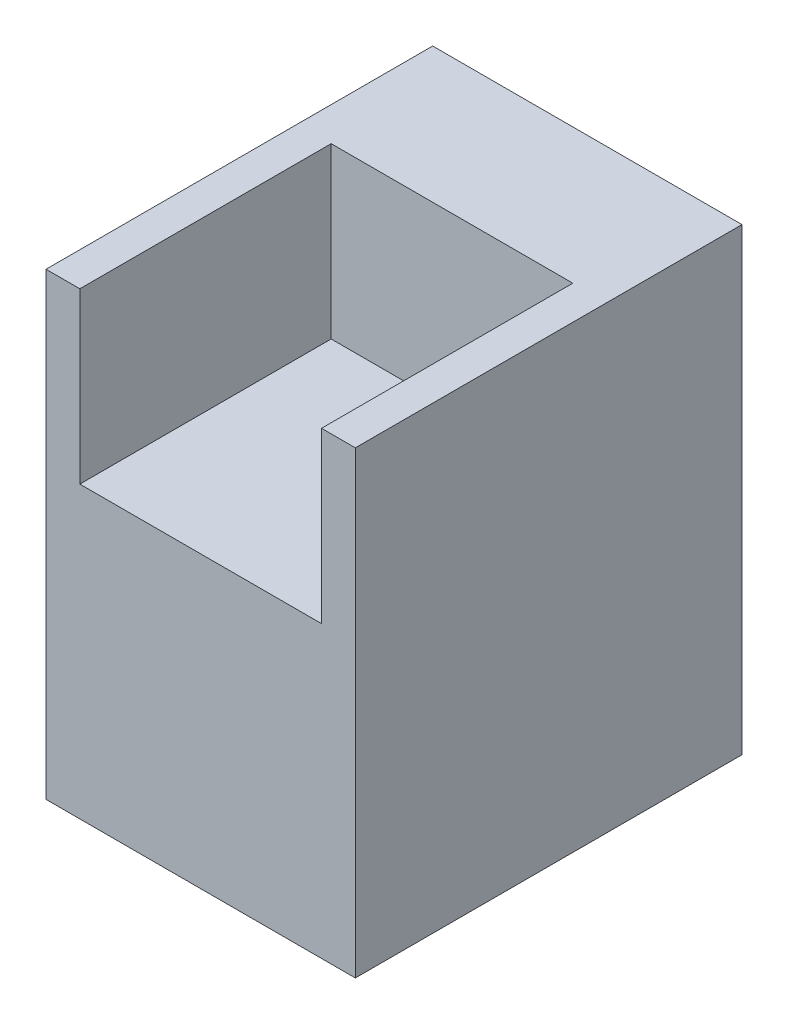
ISO-10303-21;
HEADER;
FILE_DESCRIPTION(('STEP AP214'),'2;1');
FILE_NAME('part.step','',(''),(''),'','','');
FILE_SCHEMA(('AUTOMOTIVE_DESIGN { 1 0 10303 214 1 1 1 1 }'));
ENDSEC;
DATA;
#1=APPLICATION_CONTEXT('core data for automotive mechanical design processes');
#2=APPLICATION_PROTOCOL_DEFINITION('international standard','automotive_design',2000,#1);
#3=PRODUCT_CONTEXT('',#1,'mechanical');
#4=PRODUCT('Part','Part','',(#3));
#5=PRODUCT_RELATED_PRODUCT_CATEGORY('part','',(#4));
#6=PRODUCT_DEFINITION_FORMATION('','',#4);
#7=PRODUCT_DEFINITION_CONTEXT('part definition',#1,'design');
#8=PRODUCT_DEFINITION('design','',#6,#7);
#9=PRODUCT_DEFINITION_SHAPE('','',#8);
#10=(LENGTH_UNIT() NAMED_UNIT(*) SI_UNIT(.MILLI.,.METRE.));
#11=(NAMED_UNIT(*) PLANE_ANGLE_UNIT() SI_UNIT($,.RADIAN.));
#12=(NAMED_UNIT(*) SI_UNIT($,.STERADIAN.) SOLID_ANGLE_UNIT());
#13=UNCERTAINTY_MEASURE_WITH_UNIT(LENGTH_MEASURE(1.E-05),#10,'distance_accuracy_value','');
#14=(GEOMETRIC_REPRESENTATION_CONTEXT(3) GLOBAL_UNCERTAINTY_ASSIGNED_CONTEXT((#13)) GLOBAL_UNIT_ASSIGNED_CONTEXT((#10,
#11,#12)) REPRESENTATION_CONTEXT('',''));
#15=CARTESIAN_POINT('',(0.,0.,0.));
#16=DIRECTION('',(0.,0.,1.));
#17=DIRECTION('',(1.,0.,0.));
#18=AXIS2_PLACEMENT_3D('',#15,#16,#17);
#19=CARTESIAN_POINT('',(30.,120.,-800.));
#20=DIRECTION('',(-1.,0.,0.));
#21=DIRECTION('',(0.,0.,1.));
#22=AXIS2_PLACEMENT_3D('',#19,#20,#21);
#23=PLANE('',#22);
#24=DIRECTION('',(0.,-1.,0.));
#25=VECTOR('',#24,1.);
#26=CARTESIAN_POINT('',(30.,120.,0.));
#27=LINE('',#26,#25);
#28=CARTESIAN_POINT('',(30.,1070.,0.));
#29=VERTEX_POINT('',#28);
#30=CARTESIAN_POINT('',(30.,120.,0.));
#31=VERTEX_POINT('',#30);
#32=EDGE_CURVE('E139',#29,#31,#27,.T.);
#33=ORIENTED_EDGE('',*,*,#32,.F.);
#34=DIRECTION('',(0.,0.,1.));
#35=VECTOR('',#34,1.);
#36=CARTESIAN_POINT('',(30.,1070.,-800.));
#37=LINE('',#36,#35);
#38=CARTESIAN_POINT('',(30.,1070.,-800.));
#39=VERTEX_POINT('',#38);
#40=EDGE_CURVE('E62',#39,#29,#37,.T.);
#41=ORIENTED_EDGE('',*,*,#40,.F.);
#42=DIRECTION('',(0.,-1.,0.));
#43=VECTOR('',#42,1.);
#44=CARTESIAN_POINT('',(30.,120.,-800.));
#45=LINE('',#44,#43);
#46=CARTESIAN_POINT('',(30.,120.,-800.));
#47=VERTEX_POINT('',#46);
#48=EDGE_CURVE('E140',#39,#47,#45,.T.);
#49=ORIENTED_EDGE('',*,*,#48,.T.);
#50=DIRECTION('',(0.,0.,1.));
#51=VECTOR('',#50,1.);
#52=CARTESIAN_POINT('',(30.,120.,-800.));
#53=LINE('',#52,#51);
#54=EDGE_CURVE('E91',#47,#31,#53,.T.);
#55=ORIENTED_EDGE('',*,*,#54,.T.);
#56=EDGE_LOOP('',(#33,#41,#49,#55));
#57=FACE_BOUND('',#56,.T.);
#58=ADVANCED_FACE('F39',(#57),#23,.T.);
#59=CARTESIAN_POINT('',(30.,1070.,-800.));
#60=DIRECTION('',(0.,1.,0.));
#61=DIRECTION('',(0.,0.,1.));
#62=AXIS2_PLACEMENT_3D('',#59,#60,#61);
#63=PLANE('',#62);
#64=DIRECTION('',(0.,0.,1.));
#65=VECTOR('',#64,1.);
#66=CARTESIAN_POINT('',(100.,1070.,-800.));
#67=LINE('',#66,#65);
#68=CARTESIAN_POINT('',(100.,1070.,-520.));
#69=VERTEX_POINT('',#68);
#70=CARTESIAN_POINT('',(100.,1070.,0.));
#71=VERTEX_POINT('',#70);
#72=EDGE_CURVE('E137',#69,#71,#67,.T.);
#73=ORIENTED_EDGE('',*,*,#72,.F.);
#74=DIRECTION('',(-1.,0.,0.));
#75=VECTOR('',#74,1.);
#76=CARTESIAN_POINT('',(30.,1070.,-520.));
#77=LINE('',#76,#75);
#78=CARTESIAN_POINT('',(600.,1070.,-520.));
#79=VERTEX_POINT('',#78);
#80=EDGE_CURVE('E11',#79,#69,#77,.T.);
#81=ORIENTED_EDGE('',*,*,#80,.F.);
#82=DIRECTION('',(0.,0.,-1.));
#83=VECTOR('',#82,1.);
#84=CARTESIAN_POINT('',(600.,1070.,-800.));
#85=LINE('',#84,#83);
#86=CARTESIAN_POINT('',(600.,1070.,0.));
#87=VERTEX_POINT('',#86);
#88=EDGE_CURVE('E134',#87,#79,#85,.T.);
#89=ORIENTED_EDGE('',*,*,#88,.F.);
#90=DIRECTION('',(-1.,0.,0.));
#91=VECTOR('',#90,1.);
#92=CARTESIAN_POINT('',(30.,1070.,0.));
#93=LINE('',#92,#91);
#94=CARTESIAN_POINT('',(670.,1070.,0.));
#95=VERTEX_POINT('',#94);
#96=EDGE_CURVE('E143',#95,#87,#93,.T.);
#97=ORIENTED_EDGE('',*,*,#96,.F.);
#98=DIRECTION('',(0.,0.,1.));
#99=VECTOR('',#98,1.);
#100=CARTESIAN_POINT('',(670.,1070.,-800.));
#101=LINE('',#100,#99);
#102=CARTESIAN_POINT('',(670.,1070.,-800.));
#103=VERTEX_POINT('',#102);
#104=EDGE_CURVE('E162',#103,#95,#101,.T.);
#105=ORIENTED_EDGE('',*,*,#104,.F.);
#106=DIRECTION('',(-1.,0.,0.));
#107=VECTOR('',#106,1.);
#108=CARTESIAN_POINT('',(30.,1070.,-800.));
#109=LINE('',#108,#107);
#110=EDGE_CURVE('E148',#103,#39,#109,.T.);
#111=ORIENTED_EDGE('',*,*,#110,.T.);
#112=ORIENTED_EDGE('',*,*,#40,.T.);
#113=EDGE_CURVE('E85',#71,#29,#93,.T.);
#114=ORIENTED_EDGE('',*,*,#113,.F.);
#115=EDGE_LOOP('',(#73,#81,#89,#97,#105,#111,#112,#114));
#116=FACE_BOUND('',#115,.T.);
#117=ADVANCED_FACE('F172',(#116),#63,.T.);
#118=CARTESIAN_POINT('',(670.,120.,-800.));
#119=DIRECTION('',(1.,0.,0.));
#120=DIRECTION('',(0.,0.,-1.));
#121=AXIS2_PLACEMENT_3D('',#118,#119,#120);
#122=PLANE('',#121);
#123=DIRECTION('',(0.,1.,0.));
#124=VECTOR('',#123,1.);
#125=CARTESIAN_POINT('',(670.,120.,0.));
#126=LINE('',#125,#124);
#127=CARTESIAN_POINT('',(670.,120.,0.));
#128=VERTEX_POINT('',#127);
#129=EDGE_CURVE('E155',#128,#95,#126,.T.);
#130=ORIENTED_EDGE('',*,*,#129,.F.);
#131=DIRECTION('',(0.,0.,1.));
#132=VECTOR('',#131,1.);
#133=CARTESIAN_POINT('',(670.,120.,-800.));
#134=LINE('',#133,#132);
#135=CARTESIAN_POINT('',(670.,120.,-800.));
#136=VERTEX_POINT('',#135);
#137=EDGE_CURVE('E164',#136,#128,#134,.T.);
#138=ORIENTED_EDGE('',*,*,#137,.F.);
#139=DIRECTION('',(0.,1.,0.));
#140=VECTOR('',#139,1.);
#141=CARTESIAN_POINT('',(670.,120.,-800.));
#142=LINE('',#141,#140);
#143=EDGE_CURVE('E145',#136,#103,#142,.T.);
#144=ORIENTED_EDGE('',*,*,#143,.T.);
#145=ORIENTED_EDGE('',*,*,#104,.T.);
#146=EDGE_LOOP('',(#130,#138,#144,#145));
#147=FACE_BOUND('',#146,.T.);
#148=ADVANCED_FACE('F179',(#147),#122,.T.);
#149=CARTESIAN_POINT('',(30.,120.,-800.));
#150=DIRECTION('',(0.,-1.,0.));
#151=DIRECTION('',(0.,0.,-1.));
#152=AXIS2_PLACEMENT_3D('',#149,#150,#151);
#153=PLANE('',#152);
#154=DIRECTION('',(1.,0.,0.));
#155=VECTOR('',#154,1.);
#156=CARTESIAN_POINT('',(30.,120.,0.));
#157=LINE('',#156,#155);
#158=EDGE_CURVE('E152',#31,#128,#157,.T.);
#159=ORIENTED_EDGE('',*,*,#158,.F.);
#160=ORIENTED_EDGE('',*,*,#54,.F.);
#161=DIRECTION('',(1.,0.,0.));
#162=VECTOR('',#161,1.);
#163=CARTESIAN_POINT('',(30.,120.,-800.));
#164=LINE('',#163,#162);
#165=EDGE_CURVE('E142',#47,#136,#164,.T.);
#166=ORIENTED_EDGE('',*,*,#165,.T.);
#167=ORIENTED_EDGE('',*,*,#137,.T.);
#168=EDGE_LOOP('',(#159,#160,#166,#167));
#169=FACE_BOUND('',#168,.T.);
#170=ADVANCED_FACE('F176',(#169),#153,.T.);
#171=CARTESIAN_POINT('',(0.,0.,-800.));
#172=DIRECTION('',(0.,0.,-1.));
#173=DIRECTION('',(-1.,0.,0.));
#174=AXIS2_PLACEMENT_3D('',#171,#172,#173);
#175=PLANE('',#174);
#176=ORIENTED_EDGE('',*,*,#48,.F.);
#177=ORIENTED_EDGE('',*,*,#110,.F.);
#178=ORIENTED_EDGE('',*,*,#143,.F.);
#179=ORIENTED_EDGE('',*,*,#165,.F.);
#180=EDGE_LOOP('',(#176,#177,#178,#179));
#181=FACE_BOUND('',#180,.T.);
#182=ADVANCED_FACE('F206',(#181),#175,.T.);
#183=CARTESIAN_POINT('',(0.,0.,0.));
#184=DIRECTION('',(0.,0.,-1.));
#185=DIRECTION('',(-1.,0.,0.));
#186=AXIS2_PLACEMENT_3D('',#183,#184,#185);
#187=PLANE('',#186);
#188=DIRECTION('',(-1.,0.,0.));
#189=VECTOR('',#188,1.);
#190=CARTESIAN_POINT('',(0.,720.,0.));
#191=LINE('',#190,#189);
#192=CARTESIAN_POINT('',(600.,720.,0.));
#193=VERTEX_POINT('',#192);
#194=CARTESIAN_POINT('',(100.,720.,0.));
#195=VERTEX_POINT('',#194);
#196=EDGE_CURVE('E161',#193,#195,#191,.T.);
#197=ORIENTED_EDGE('',*,*,#196,.T.);
#198=DIRECTION('',(0.,1.,0.));
#199=VECTOR('',#198,1.);
#200=CARTESIAN_POINT('',(100.,0.,0.));
#201=LINE('',#200,#199);
#202=EDGE_CURVE('E46',#195,#71,#201,.T.);
#203=ORIENTED_EDGE('',*,*,#202,.T.);
#204=ORIENTED_EDGE('',*,*,#113,.T.);
#205=ORIENTED_EDGE('',*,*,#32,.T.);
#206=ORIENTED_EDGE('',*,*,#158,.T.);
#207=ORIENTED_EDGE('',*,*,#129,.T.);
#208=ORIENTED_EDGE('',*,*,#96,.T.);
#209=DIRECTION('',(0.,-1.,0.));
#210=VECTOR('',#209,1.);
#211=CARTESIAN_POINT('',(600.,0.,0.));
#212=LINE('',#211,#210);
#213=EDGE_CURVE('E168',#87,#193,#212,.T.);
#214=ORIENTED_EDGE('',*,*,#213,.T.);
#215=EDGE_LOOP('',(#197,#203,#204,#205,#206,#207,#208,#214));
#216=FACE_BOUND('',#215,.T.);
#217=ADVANCED_FACE('F170',(#216),#187,.F.);
#218=CARTESIAN_POINT('',(100.,720.,-520.));
#219=DIRECTION('',(0.,-1.,0.));
#220=DIRECTION('',(0.,0.,-1.));
#221=AXIS2_PLACEMENT_3D('',#218,#219,#220);
#222=PLANE('',#221);
#223=DIRECTION('',(0.,0.,1.));
#224=VECTOR('',#223,1.);
#225=CARTESIAN_POINT('',(600.,720.,-520.));
#226=LINE('',#225,#224);
#227=CARTESIAN_POINT('',(600.,720.,-520.));
#228=VERTEX_POINT('',#227);
#229=EDGE_CURVE('E125',#228,#193,#226,.T.);
#230=ORIENTED_EDGE('',*,*,#229,.F.);
#231=DIRECTION('',(1.,0.,0.));
#232=VECTOR('',#231,1.);
#233=CARTESIAN_POINT('',(100.,720.,-520.));
#234=LINE('',#233,#232);
#235=CARTESIAN_POINT('',(100.,720.,-520.));
#236=VERTEX_POINT('',#235);
#237=EDGE_CURVE('E118',#236,#228,#234,.T.);
#238=ORIENTED_EDGE('',*,*,#237,.F.);
#239=DIRECTION('',(0.,0.,1.));
#240=VECTOR('',#239,1.);
#241=CARTESIAN_POINT('',(100.,720.,-520.));
#242=LINE('',#241,#240);
#243=EDGE_CURVE('E53',#236,#195,#242,.T.);
#244=ORIENTED_EDGE('',*,*,#243,.T.);
#245=ORIENTED_EDGE('',*,*,#196,.F.);
#246=EDGE_LOOP('',(#230,#238,#244,#245));
#247=FACE_BOUND('',#246,.T.);
#248=ADVANCED_FACE('F128',(#247),#222,.F.);
#249=CARTESIAN_POINT('',(100.,720.,-520.));
#250=DIRECTION('',(-1.,0.,0.));
#251=DIRECTION('',(0.,0.,1.));
#252=AXIS2_PLACEMENT_3D('',#249,#250,#251);
#253=PLANE('',#252);
#254=ORIENTED_EDGE('',*,*,#72,.T.);
#255=ORIENTED_EDGE('',*,*,#202,.F.);
#256=ORIENTED_EDGE('',*,*,#243,.F.);
#257=DIRECTION('',(0.,-1.,0.));
#258=VECTOR('',#257,1.);
#259=CARTESIAN_POINT('',(100.,720.,-520.));
#260=LINE('',#259,#258);
#261=EDGE_CURVE('E115',#69,#236,#260,.T.);
#262=ORIENTED_EDGE('',*,*,#261,.F.);
#263=EDGE_LOOP('',(#254,#255,#256,#262));
#264=FACE_BOUND('',#263,.T.);
#265=ADVANCED_FACE('F123',(#264),#253,.F.);
#266=CARTESIAN_POINT('',(600.,720.,-520.));
#267=DIRECTION('',(1.,0.,0.));
#268=DIRECTION('',(0.,0.,-1.));
#269=AXIS2_PLACEMENT_3D('',#266,#267,#268);
#270=PLANE('',#269);
#271=ORIENTED_EDGE('',*,*,#88,.T.);
#272=DIRECTION('',(0.,1.,0.));
#273=VECTOR('',#272,1.);
#274=CARTESIAN_POINT('',(600.,720.,-520.));
#275=LINE('',#274,#273);
#276=EDGE_CURVE('E126',#228,#79,#275,.T.);
#277=ORIENTED_EDGE('',*,*,#276,.F.);
#278=ORIENTED_EDGE('',*,*,#229,.T.);
#279=ORIENTED_EDGE('',*,*,#213,.F.);
#280=EDGE_LOOP('',(#271,#277,#278,#279));
#281=FACE_BOUND('',#280,.T.);
#282=ADVANCED_FACE('F182',(#281),#270,.F.);
#283=CARTESIAN_POINT('',(0.,0.,-520.));
#284=DIRECTION('',(0.,0.,-1.));
#285=DIRECTION('',(-1.,0.,0.));
#286=AXIS2_PLACEMENT_3D('',#283,#284,#285);
#287=PLANE('',#286);
#288=ORIENTED_EDGE('',*,*,#80,.T.);
#289=ORIENTED_EDGE('',*,*,#261,.T.);
#290=ORIENTED_EDGE('',*,*,#237,.T.);
#291=ORIENTED_EDGE('',*,*,#276,.T.);
#292=EDGE_LOOP('',(#288,#289,#290,#291));
#293=FACE_BOUND('',#292,.T.);
#294=ADVANCED_FACE('F116',(#293),#287,.F.);
#295=CLOSED_SHELL('',(#58,#117,#148,#170,#182,#217,#248,#265,#282,#294));
#296=MANIFOLD_SOLID_BREP('B2',#295);
#297=ADVANCED_BREP_SHAPE_REPRESENTATION('',(#18,#296),#14);
#298=SHAPE_DEFINITION_REPRESENTATION(#9,#297);
ENDSEC;
END-ISO-10303-21;
